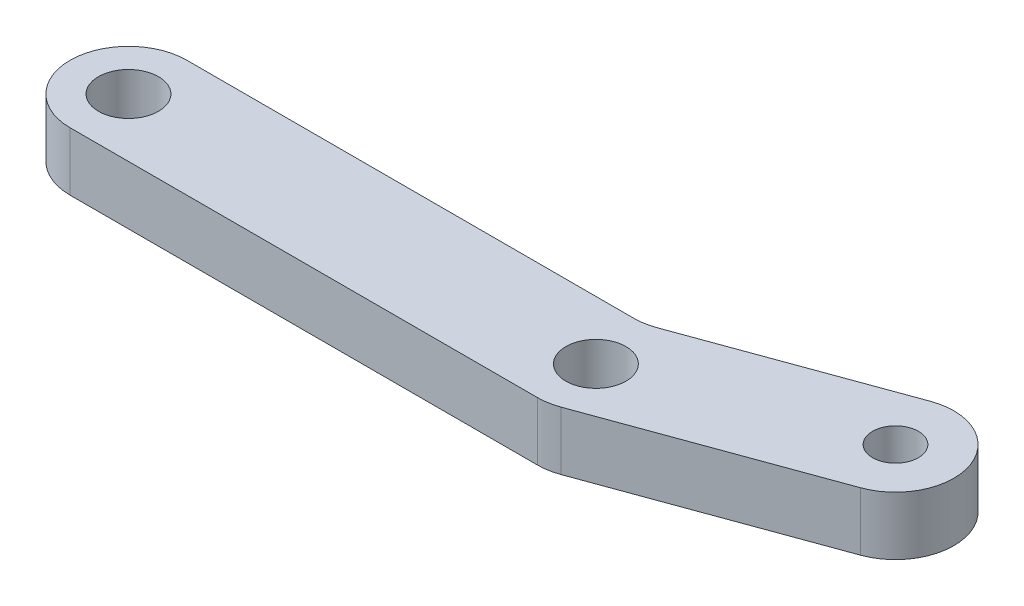
ISO-10303-21;
HEADER;
FILE_DESCRIPTION(('STEP AP214'),'2;1');
FILE_NAME('part.step','',(''),(''),'','','');
FILE_SCHEMA(('AUTOMOTIVE_DESIGN { 1 0 10303 214 1 1 1 1 }'));
ENDSEC;
DATA;
#1=APPLICATION_CONTEXT('core data for automotive mechanical design processes');
#2=APPLICATION_PROTOCOL_DEFINITION('international standard','automotive_design',2000,#1);
#3=PRODUCT_CONTEXT('',#1,'mechanical');
#4=PRODUCT('Part','Part','',(#3));
#5=PRODUCT_RELATED_PRODUCT_CATEGORY('part','',(#4));
#6=PRODUCT_DEFINITION_FORMATION('','',#4);
#7=PRODUCT_DEFINITION_CONTEXT('part definition',#1,'design');
#8=PRODUCT_DEFINITION('design','',#6,#7);
#9=PRODUCT_DEFINITION_SHAPE('','',#8);
#10=(LENGTH_UNIT() NAMED_UNIT(*) SI_UNIT(.MILLI.,.METRE.));
#11=(NAMED_UNIT(*) PLANE_ANGLE_UNIT() SI_UNIT($,.RADIAN.));
#12=(NAMED_UNIT(*) SI_UNIT($,.STERADIAN.) SOLID_ANGLE_UNIT());
#13=UNCERTAINTY_MEASURE_WITH_UNIT(LENGTH_MEASURE(1.E-05),#10,'distance_accuracy_value','');
#14=(GEOMETRIC_REPRESENTATION_CONTEXT(3) GLOBAL_UNCERTAINTY_ASSIGNED_CONTEXT((#13)) GLOBAL_UNIT_ASSIGNED_CONTEXT((#10,
#11,#12)) REPRESENTATION_CONTEXT('',''));
#15=CARTESIAN_POINT('',(0.,0.,0.));
#16=DIRECTION('',(0.,0.,1.));
#17=DIRECTION('',(1.,0.,0.));
#18=AXIS2_PLACEMENT_3D('',#15,#16,#17);
#19=CARTESIAN_POINT('',(50.8,3.175,0.));
#20=DIRECTION('',(0.,-1.,0.));
#21=DIRECTION('',(0.,0.,-1.));
#22=AXIS2_PLACEMENT_3D('',#19,#20,#21);
#23=CYLINDRICAL_SURFACE('',#22,6.35);
#24=DIRECTION('',(0.,-1.,0.));
#25=VECTOR('',#24,1.);
#26=CARTESIAN_POINT('',(52.971827910118,40.9009215497809,5.96704814199052));
#27=LINE('',#26,#25);
#28=CARTESIAN_POINT('',(52.971827910118,3.175,5.96704814199052));
#29=VERTEX_POINT('',#28);
#30=CARTESIAN_POINT('',(52.971827910118,-3.175,5.96704814199052));
#31=VERTEX_POINT('',#30);
#32=EDGE_CURVE('E115',#29,#31,#27,.T.);
#33=ORIENTED_EDGE('',*,*,#32,.F.);
#34=CARTESIAN_POINT('',(50.8,3.175,0.));
#35=DIRECTION('',(0.,1.,0.));
#36=DIRECTION('',(0.,0.,1.));
#37=AXIS2_PLACEMENT_3D('',#34,#35,#36);
#38=CIRCLE('',#37,6.35);
#39=CARTESIAN_POINT('',(50.8,3.175,6.35));
#40=VERTEX_POINT('',#39);
#41=EDGE_CURVE('E147',#40,#29,#38,.T.);
#42=ORIENTED_EDGE('',*,*,#41,.F.);
#43=DIRECTION('',(0.,-1.,0.));
#44=VECTOR('',#43,1.);
#45=CARTESIAN_POINT('',(50.8,3.175,6.35));
#46=LINE('',#45,#44);
#47=CARTESIAN_POINT('',(50.8,-3.175,6.35));
#48=VERTEX_POINT('',#47);
#49=EDGE_CURVE('E162',#40,#48,#46,.T.);
#50=ORIENTED_EDGE('',*,*,#49,.T.);
#51=CARTESIAN_POINT('',(50.8,-3.175,0.));
#52=DIRECTION('',(0.,1.,0.));
#53=DIRECTION('',(0.,0.,1.));
#54=AXIS2_PLACEMENT_3D('',#51,#52,#53);
#55=CIRCLE('',#54,6.35);
#56=EDGE_CURVE('E156',#48,#31,#55,.T.);
#57=ORIENTED_EDGE('',*,*,#56,.T.);
#58=EDGE_LOOP('',(#33,#42,#50,#57));
#59=FACE_BOUND('',#58,.T.);
#60=ADVANCED_FACE('F35',(#59),#23,.T.);
#61=CARTESIAN_POINT('',(0.,3.175,0.));
#62=DIRECTION('',(0.,1.,0.));
#63=DIRECTION('',(0.,0.,1.));
#64=AXIS2_PLACEMENT_3D('',#61,#62,#63);
#65=PLANE('',#64);
#66=ORIENTED_EDGE('',*,*,#41,.T.);
#67=DIRECTION('',(0.939692620785908,0.,-0.34202014332567));
#68=VECTOR('',#67,1.);
#69=CARTESIAN_POINT('',(8.11429905489599,3.175,22.2938534280287));
#70=LINE('',#69,#68);
#71=CARTESIAN_POINT('',(76.8400204780801,3.175,-2.72026349848149));
#72=VERTEX_POINT('',#71);
#73=EDGE_CURVE('E105',#29,#72,#70,.T.);
#74=ORIENTED_EDGE('',*,*,#73,.T.);
#75=CARTESIAN_POINT('',(74.6681925679621,3.175,-8.68731164047201));
#76=DIRECTION('',(0.,1.,0.));
#77=DIRECTION('',(0.,0.,1.));
#78=AXIS2_PLACEMENT_3D('',#75,#76,#77);
#79=CIRCLE('',#78,6.35);
#80=CARTESIAN_POINT('',(72.4963646578441,3.175,-14.6543597824625));
#81=VERTEX_POINT('',#80);
#82=EDGE_CURVE('E108',#81,#72,#79,.F.);
#83=ORIENTED_EDGE('',*,*,#82,.F.);
#84=DIRECTION('',(0.939692620785908,0.,-0.342020143325669));
#85=VECTOR('',#84,1.);
#86=CARTESIAN_POINT('',(3.77064323465998,3.175,10.3597571440476));
#87=LINE('',#86,#85);
#88=CARTESIAN_POINT('',(50.7324752551205,3.175,-6.73295185800948));
#89=VERTEX_POINT('',#88);
#90=EDGE_CURVE('E96',#89,#81,#87,.T.);
#91=ORIENTED_EDGE('',*,*,#90,.F.);
#92=CARTESIAN_POINT('',(48.5606473450025,3.175,-12.7));
#93=DIRECTION('',(0.,1.,0.));
#94=DIRECTION('',(0.,0.,1.));
#95=AXIS2_PLACEMENT_3D('',#92,#93,#94);
#96=CIRCLE('',#95,6.35);
#97=CARTESIAN_POINT('',(48.5606473450025,3.175,-6.35));
#98=VERTEX_POINT('',#97);
#99=EDGE_CURVE('E11',#89,#98,#96,.F.);
#100=ORIENTED_EDGE('',*,*,#99,.T.);
#101=DIRECTION('',(-1.,0.,0.));
#102=VECTOR('',#101,1.);
#103=CARTESIAN_POINT('',(0.,3.175,-6.35));
#104=LINE('',#103,#102);
#105=CARTESIAN_POINT('',(0.,3.175,-6.35));
#106=VERTEX_POINT('',#105);
#107=EDGE_CURVE('E149',#98,#106,#104,.T.);
#108=ORIENTED_EDGE('',*,*,#107,.T.);
#109=CARTESIAN_POINT('',(0.,3.175,0.));
#110=DIRECTION('',(0.,1.,0.));
#111=DIRECTION('',(0.,0.,1.));
#112=AXIS2_PLACEMENT_3D('',#109,#110,#111);
#113=CIRCLE('',#112,6.35);
#114=CARTESIAN_POINT('',(0.,3.175,6.35));
#115=VERTEX_POINT('',#114);
#116=EDGE_CURVE('E141',#106,#115,#113,.T.);
#117=ORIENTED_EDGE('',*,*,#116,.T.);
#118=DIRECTION('',(1.,0.,0.));
#119=VECTOR('',#118,1.);
#120=CARTESIAN_POINT('',(0.,3.175,6.35));
#121=LINE('',#120,#119);
#122=EDGE_CURVE('E144',#115,#40,#121,.T.);
#123=ORIENTED_EDGE('',*,*,#122,.T.);
#124=EDGE_LOOP('',(#66,#74,#83,#91,#100,#108,#117,#123));
#125=FACE_BOUND('',#124,.T.);
#126=CARTESIAN_POINT('',(0.,3.175,0.));
#127=DIRECTION('',(0.,1.,0.));
#128=DIRECTION('',(0.,0.,1.));
#129=AXIS2_PLACEMENT_3D('',#126,#127,#128);
#130=CIRCLE('',#129,3.2639);
#131=CARTESIAN_POINT('',(0.,3.175,3.2639));
#132=VERTEX_POINT('',#131);
#133=EDGE_CURVE('E135',#132,#132,#130,.T.);
#134=ORIENTED_EDGE('',*,*,#133,.F.);
#135=EDGE_LOOP('',(#134));
#136=FACE_BOUND('',#135,.T.);
#137=CARTESIAN_POINT('',(50.8,3.175,0.));
#138=DIRECTION('',(0.,1.,0.));
#139=DIRECTION('',(0.,0.,1.));
#140=AXIS2_PLACEMENT_3D('',#137,#138,#139);
#141=CIRCLE('',#140,3.2639);
#142=CARTESIAN_POINT('',(50.8,3.175,3.2639));
#143=VERTEX_POINT('',#142);
#144=EDGE_CURVE('E128',#143,#143,#141,.T.);
#145=ORIENTED_EDGE('',*,*,#144,.F.);
#146=EDGE_LOOP('',(#145));
#147=FACE_BOUND('',#146,.T.);
#148=CARTESIAN_POINT('',(74.6681925679621,3.175,-8.68731164047201));
#149=DIRECTION('',(0.,1.,0.));
#150=DIRECTION('',(0.,0.,1.));
#151=AXIS2_PLACEMENT_3D('',#148,#149,#150);
#152=CIRCLE('',#151,2.4892);
#153=CARTESIAN_POINT('',(74.6681925679621,3.175,-6.198111640472));
#154=VERTEX_POINT('',#153);
#155=EDGE_CURVE('E114',#154,#154,#152,.F.);
#156=ORIENTED_EDGE('',*,*,#155,.T.);
#157=EDGE_LOOP('',(#156));
#158=FACE_BOUND('',#157,.T.);
#159=ADVANCED_FACE('F110',(#125,#136,#147,#158),#65,.T.);
#160=CARTESIAN_POINT('',(0.,-3.175,0.));
#161=DIRECTION('',(0.,1.,0.));
#162=DIRECTION('',(0.,0.,1.));
#163=AXIS2_PLACEMENT_3D('',#160,#161,#162);
#164=PLANE('',#163);
#165=DIRECTION('',(0.939692620785908,0.,-0.34202014332567));
#166=VECTOR('',#165,1.);
#167=CARTESIAN_POINT('',(8.11429905489599,-3.175,22.2938534280287));
#168=LINE('',#167,#166);
#169=CARTESIAN_POINT('',(76.8400204780801,-3.175,-2.72026349848149));
#170=VERTEX_POINT('',#169);
#171=EDGE_CURVE('E121',#31,#170,#168,.T.);
#172=ORIENTED_EDGE('',*,*,#171,.F.);
#173=ORIENTED_EDGE('',*,*,#56,.F.);
#174=DIRECTION('',(1.,0.,0.));
#175=VECTOR('',#174,1.);
#176=CARTESIAN_POINT('',(0.,-3.175,6.35));
#177=LINE('',#176,#175);
#178=CARTESIAN_POINT('',(0.,-3.175,6.35));
#179=VERTEX_POINT('',#178);
#180=EDGE_CURVE('E154',#179,#48,#177,.T.);
#181=ORIENTED_EDGE('',*,*,#180,.F.);
#182=CARTESIAN_POINT('',(0.,-3.175,0.));
#183=DIRECTION('',(0.,1.,0.));
#184=DIRECTION('',(0.,0.,1.));
#185=AXIS2_PLACEMENT_3D('',#182,#183,#184);
#186=CIRCLE('',#185,6.35);
#187=CARTESIAN_POINT('',(0.,-3.175,-6.35));
#188=VERTEX_POINT('',#187);
#189=EDGE_CURVE('E138',#188,#179,#186,.T.);
#190=ORIENTED_EDGE('',*,*,#189,.F.);
#191=DIRECTION('',(-1.,0.,0.));
#192=VECTOR('',#191,1.);
#193=CARTESIAN_POINT('',(0.,-3.175,-6.35));
#194=LINE('',#193,#192);
#195=CARTESIAN_POINT('',(48.5606473450025,-3.175,-6.35));
#196=VERTEX_POINT('',#195);
#197=EDGE_CURVE('E145',#196,#188,#194,.T.);
#198=ORIENTED_EDGE('',*,*,#197,.F.);
#199=CARTESIAN_POINT('',(48.5606473450025,-3.175,-12.7));
#200=DIRECTION('',(0.,1.,0.));
#201=DIRECTION('',(0.,0.,1.));
#202=AXIS2_PLACEMENT_3D('',#199,#200,#201);
#203=CIRCLE('',#202,6.35);
#204=CARTESIAN_POINT('',(50.7324752551205,-3.175,-6.73295185800949));
#205=VERTEX_POINT('',#204);
#206=EDGE_CURVE('E43',#196,#205,#203,.T.);
#207=ORIENTED_EDGE('',*,*,#206,.T.);
#208=DIRECTION('',(0.939692620785908,0.,-0.342020143325669));
#209=VECTOR('',#208,1.);
#210=CARTESIAN_POINT('',(3.77064323465998,-3.175,10.3597571440476));
#211=LINE('',#210,#209);
#212=CARTESIAN_POINT('',(72.4963646578441,-3.175,-14.6543597824625));
#213=VERTEX_POINT('',#212);
#214=EDGE_CURVE('E236',#205,#213,#211,.T.);
#215=ORIENTED_EDGE('',*,*,#214,.T.);
#216=CARTESIAN_POINT('',(74.6681925679621,-3.175,-8.68731164047201));
#217=DIRECTION('',(0.,-1.,0.));
#218=DIRECTION('',(0.,0.,-1.));
#219=AXIS2_PLACEMENT_3D('',#216,#217,#218);
#220=CIRCLE('',#219,6.35);
#221=EDGE_CURVE('E119',#213,#170,#220,.T.);
#222=ORIENTED_EDGE('',*,*,#221,.T.);
#223=EDGE_LOOP('',(#172,#173,#181,#190,#198,#207,#215,#222));
#224=FACE_BOUND('',#223,.T.);
#225=CARTESIAN_POINT('',(0.,-3.175,0.));
#226=DIRECTION('',(0.,1.,0.));
#227=DIRECTION('',(0.,0.,1.));
#228=AXIS2_PLACEMENT_3D('',#225,#226,#227);
#229=CIRCLE('',#228,3.2639);
#230=CARTESIAN_POINT('',(0.,-3.175,3.2639));
#231=VERTEX_POINT('',#230);
#232=EDGE_CURVE('E131',#231,#231,#229,.T.);
#233=ORIENTED_EDGE('',*,*,#232,.T.);
#234=EDGE_LOOP('',(#233));
#235=FACE_BOUND('',#234,.T.);
#236=CARTESIAN_POINT('',(50.8,-3.175,0.));
#237=DIRECTION('',(0.,1.,0.));
#238=DIRECTION('',(0.,0.,1.));
#239=AXIS2_PLACEMENT_3D('',#236,#237,#238);
#240=CIRCLE('',#239,3.2639);
#241=CARTESIAN_POINT('',(50.8,-3.175,3.2639));
#242=VERTEX_POINT('',#241);
#243=EDGE_CURVE('E132',#242,#242,#240,.T.);
#244=ORIENTED_EDGE('',*,*,#243,.T.);
#245=EDGE_LOOP('',(#244));
#246=FACE_BOUND('',#245,.T.);
#247=CARTESIAN_POINT('',(74.6681925679621,-3.175,-8.68731164047201));
#248=DIRECTION('',(0.,-1.,0.));
#249=DIRECTION('',(0.,0.,-1.));
#250=AXIS2_PLACEMENT_3D('',#247,#248,#249);
#251=CIRCLE('',#250,2.4892);
#252=CARTESIAN_POINT('',(74.6681925679621,-3.175,-11.176511640472));
#253=VERTEX_POINT('',#252);
#254=EDGE_CURVE('E104',#253,#253,#251,.T.);
#255=ORIENTED_EDGE('',*,*,#254,.F.);
#256=EDGE_LOOP('',(#255));
#257=FACE_BOUND('',#256,.T.);
#258=ADVANCED_FACE('F179',(#224,#235,#246,#257),#164,.F.);
#259=CARTESIAN_POINT('',(0.,3.175,0.));
#260=DIRECTION('',(0.,-1.,0.));
#261=DIRECTION('',(0.,0.,-1.));
#262=AXIS2_PLACEMENT_3D('',#259,#260,#261);
#263=CYLINDRICAL_SURFACE('',#262,6.35);
#264=ORIENTED_EDGE('',*,*,#189,.T.);
#265=DIRECTION('',(0.,-1.,0.));
#266=VECTOR('',#265,1.);
#267=CARTESIAN_POINT('',(0.,3.175,6.35));
#268=LINE('',#267,#266);
#269=EDGE_CURVE('E165',#115,#179,#268,.T.);
#270=ORIENTED_EDGE('',*,*,#269,.F.);
#271=ORIENTED_EDGE('',*,*,#116,.F.);
#272=DIRECTION('',(0.,-1.,0.));
#273=VECTOR('',#272,1.);
#274=CARTESIAN_POINT('',(0.,3.175,-6.35));
#275=LINE('',#274,#273);
#276=EDGE_CURVE('E151',#106,#188,#275,.T.);
#277=ORIENTED_EDGE('',*,*,#276,.T.);
#278=EDGE_LOOP('',(#264,#270,#271,#277));
#279=FACE_BOUND('',#278,.T.);
#280=ADVANCED_FACE('F184',(#279),#263,.T.);
#281=CARTESIAN_POINT('',(0.,3.175,6.35));
#282=DIRECTION('',(0.,0.,-1.));
#283=DIRECTION('',(-1.,0.,0.));
#284=AXIS2_PLACEMENT_3D('',#281,#282,#283);
#285=PLANE('',#284);
#286=ORIENTED_EDGE('',*,*,#180,.T.);
#287=ORIENTED_EDGE('',*,*,#49,.F.);
#288=ORIENTED_EDGE('',*,*,#122,.F.);
#289=ORIENTED_EDGE('',*,*,#269,.T.);
#290=EDGE_LOOP('',(#286,#287,#288,#289));
#291=FACE_BOUND('',#290,.T.);
#292=ADVANCED_FACE('F204',(#291),#285,.F.);
#293=CARTESIAN_POINT('',(0.,3.175,-6.35));
#294=DIRECTION('',(0.,0.,1.));
#295=DIRECTION('',(1.,0.,0.));
#296=AXIS2_PLACEMENT_3D('',#293,#294,#295);
#297=PLANE('',#296);
#298=ORIENTED_EDGE('',*,*,#107,.F.);
#299=DIRECTION('',(0.,-1.,0.));
#300=VECTOR('',#299,1.);
#301=CARTESIAN_POINT('',(48.5606473450025,3.175,-6.35));
#302=LINE('',#301,#300);
#303=EDGE_CURVE('E168',#98,#196,#302,.T.);
#304=ORIENTED_EDGE('',*,*,#303,.T.);
#305=ORIENTED_EDGE('',*,*,#197,.T.);
#306=ORIENTED_EDGE('',*,*,#276,.F.);
#307=EDGE_LOOP('',(#298,#304,#305,#306));
#308=FACE_BOUND('',#307,.T.);
#309=ADVANCED_FACE('F174',(#308),#297,.F.);
#310=CARTESIAN_POINT('',(0.,3.175,0.));
#311=DIRECTION('',(0.,-1.,0.));
#312=DIRECTION('',(0.,0.,-1.));
#313=AXIS2_PLACEMENT_3D('',#310,#311,#312);
#314=CYLINDRICAL_SURFACE('',#313,3.2639);
#315=ORIENTED_EDGE('',*,*,#133,.T.);
#316=EDGE_LOOP('',(#315));
#317=FACE_BOUND('',#316,.T.);
#318=ORIENTED_EDGE('',*,*,#232,.F.);
#319=EDGE_LOOP('',(#318));
#320=FACE_BOUND('',#319,.T.);
#321=ADVANCED_FACE('F214',(#317,#320),#314,.F.);
#322=CARTESIAN_POINT('',(50.8,3.175,0.));
#323=DIRECTION('',(0.,-1.,0.));
#324=DIRECTION('',(0.,0.,-1.));
#325=AXIS2_PLACEMENT_3D('',#322,#323,#324);
#326=CYLINDRICAL_SURFACE('',#325,3.2639);
#327=ORIENTED_EDGE('',*,*,#144,.T.);
#328=EDGE_LOOP('',(#327));
#329=FACE_BOUND('',#328,.T.);
#330=ORIENTED_EDGE('',*,*,#243,.F.);
#331=EDGE_LOOP('',(#330));
#332=FACE_BOUND('',#331,.T.);
#333=ADVANCED_FACE('F217',(#329,#332),#326,.F.);
#334=CARTESIAN_POINT('',(74.6681925679621,40.9009215497809,-8.68731164047201));
#335=DIRECTION('',(0.,-1.,0.));
#336=DIRECTION('',(0.,0.,-1.));
#337=AXIS2_PLACEMENT_3D('',#334,#335,#336);
#338=CYLINDRICAL_SURFACE('',#337,2.4892);
#339=ORIENTED_EDGE('',*,*,#254,.T.);
#340=EDGE_LOOP('',(#339));
#341=FACE_BOUND('',#340,.T.);
#342=ORIENTED_EDGE('',*,*,#155,.F.);
#343=EDGE_LOOP('',(#342));
#344=FACE_BOUND('',#343,.T.);
#345=ADVANCED_FACE('F221',(#341,#344),#338,.F.);
#346=CARTESIAN_POINT('',(74.6681925679621,40.9009215497809,-8.68731164047201));
#347=DIRECTION('',(0.,-1.,0.));
#348=DIRECTION('',(0.,0.,-1.));
#349=AXIS2_PLACEMENT_3D('',#346,#347,#348);
#350=CYLINDRICAL_SURFACE('',#349,6.35);
#351=DIRECTION('',(0.,-1.,0.));
#352=VECTOR('',#351,1.);
#353=CARTESIAN_POINT('',(72.4963646578441,40.9009215497809,-14.6543597824625));
#354=LINE('',#353,#352);
#355=EDGE_CURVE('E100',#81,#213,#354,.T.);
#356=ORIENTED_EDGE('',*,*,#355,.F.);
#357=ORIENTED_EDGE('',*,*,#82,.T.);
#358=DIRECTION('',(0.,-1.,0.));
#359=VECTOR('',#358,1.);
#360=CARTESIAN_POINT('',(76.8400204780801,40.9009215497809,-2.72026349848149));
#361=LINE('',#360,#359);
#362=EDGE_CURVE('E120',#72,#170,#361,.T.);
#363=ORIENTED_EDGE('',*,*,#362,.T.);
#364=ORIENTED_EDGE('',*,*,#221,.F.);
#365=EDGE_LOOP('',(#356,#357,#363,#364));
#366=FACE_BOUND('',#365,.T.);
#367=ADVANCED_FACE('F117',(#366),#350,.T.);
#368=CARTESIAN_POINT('',(8.11429905489599,40.9009215497809,22.2938534280287));
#369=DIRECTION('',(-0.34202014332567,0.,-0.939692620785908));
#370=DIRECTION('',(-0.939692620785908,0.,0.34202014332567));
#371=AXIS2_PLACEMENT_3D('',#368,#369,#370);
#372=PLANE('',#371);
#373=ORIENTED_EDGE('',*,*,#73,.F.);
#374=ORIENTED_EDGE('',*,*,#32,.T.);
#375=ORIENTED_EDGE('',*,*,#171,.T.);
#376=ORIENTED_EDGE('',*,*,#362,.F.);
#377=EDGE_LOOP('',(#373,#374,#375,#376));
#378=FACE_BOUND('',#377,.T.);
#379=ADVANCED_FACE('F191',(#378),#372,.F.);
#380=CARTESIAN_POINT('',(3.77064323465998,40.9009215497809,10.3597571440476));
#381=DIRECTION('',(-0.342020143325669,0.,-0.939692620785908));
#382=DIRECTION('',(-0.939692620785908,0.,0.342020143325669));
#383=AXIS2_PLACEMENT_3D('',#380,#381,#382);
#384=PLANE('',#383);
#385=ORIENTED_EDGE('',*,*,#214,.F.);
#386=DIRECTION('',(0.,-1.,0.));
#387=VECTOR('',#386,1.);
#388=CARTESIAN_POINT('',(50.7324752551205,40.9009215497809,-6.73295185800948));
#389=LINE('',#388,#387);
#390=EDGE_CURVE('E56',#205,#89,#389,.F.);
#391=ORIENTED_EDGE('',*,*,#390,.T.);
#392=ORIENTED_EDGE('',*,*,#90,.T.);
#393=ORIENTED_EDGE('',*,*,#355,.T.);
#394=EDGE_LOOP('',(#385,#391,#392,#393));
#395=FACE_BOUND('',#394,.T.);
#396=ADVANCED_FACE('F98',(#395),#384,.T.);
#397=CARTESIAN_POINT('',(48.5606473450025,3.175,-12.7));
#398=DIRECTION('',(0.,-1.,0.));
#399=DIRECTION('',(0.,0.,-1.));
#400=AXIS2_PLACEMENT_3D('',#397,#398,#399);
#401=CYLINDRICAL_SURFACE('',#400,6.35);
#402=ORIENTED_EDGE('',*,*,#99,.F.);
#403=ORIENTED_EDGE('',*,*,#390,.F.);
#404=ORIENTED_EDGE('',*,*,#206,.F.);
#405=ORIENTED_EDGE('',*,*,#303,.F.);
#406=EDGE_LOOP('',(#402,#403,#404,#405));
#407=FACE_BOUND('',#406,.T.);
#408=ADVANCED_FACE('F37',(#407),#401,.F.);
#409=CLOSED_SHELL('',(#60,#159,#258,#280,#292,#309,#321,#333,#345,#367,#379,#396,#408));
#410=MANIFOLD_SOLID_BREP('B2',#409);
#411=ADVANCED_BREP_SHAPE_REPRESENTATION('',(#18,#410),#14);
#412=SHAPE_DEFINITION_REPRESENTATION(#9,#411);
ENDSEC;
END-ISO-10303-21;
